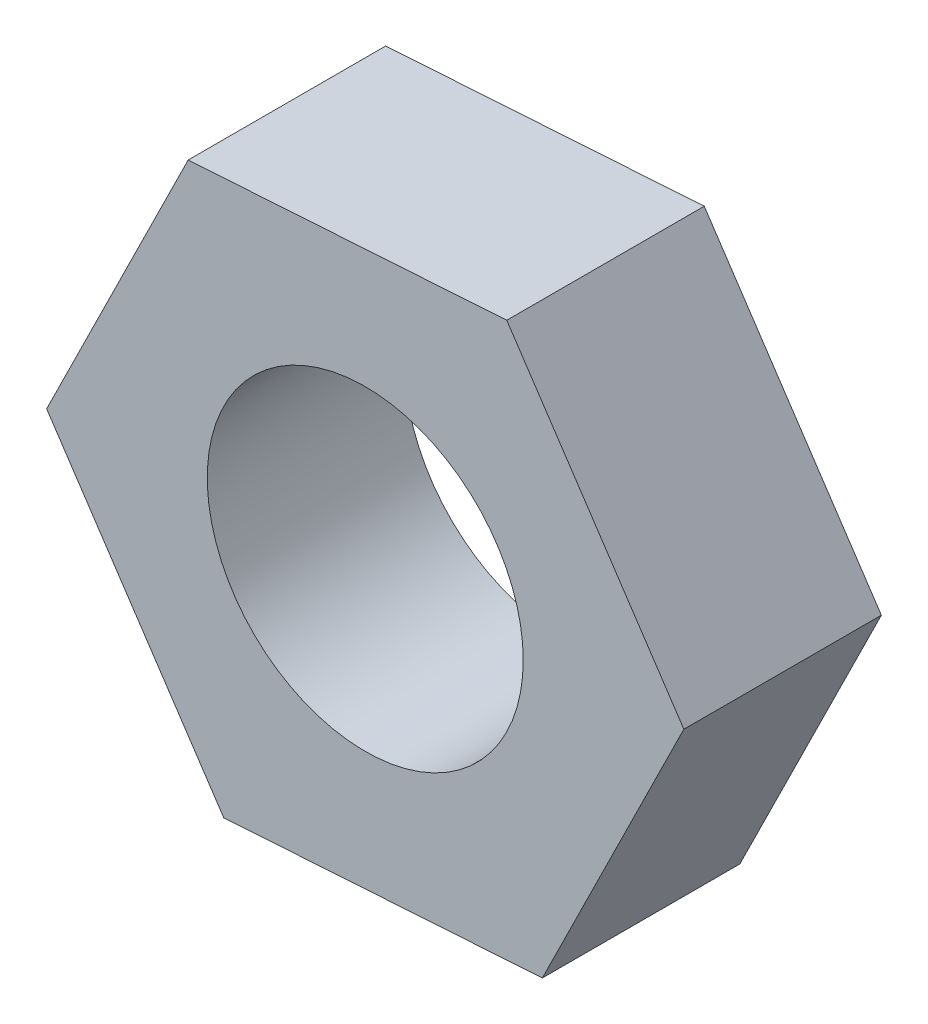
ISO-10303-21;
HEADER;
FILE_DESCRIPTION(('STEP AP214'),'2;1');
FILE_NAME('part.step','',(''),(''),'','','');
FILE_SCHEMA(('AUTOMOTIVE_DESIGN { 1 0 10303 214 1 1 1 1 }'));
ENDSEC;
DATA;
#1=APPLICATION_CONTEXT('core data for automotive mechanical design processes');
#2=APPLICATION_PROTOCOL_DEFINITION('international standard','automotive_design',2000,#1);
#3=PRODUCT_CONTEXT('',#1,'mechanical');
#4=PRODUCT('Part','Part','',(#3));
#5=PRODUCT_RELATED_PRODUCT_CATEGORY('part','',(#4));
#6=PRODUCT_DEFINITION_FORMATION('','',#4);
#7=PRODUCT_DEFINITION_CONTEXT('part definition',#1,'design');
#8=PRODUCT_DEFINITION('design','',#6,#7);
#9=PRODUCT_DEFINITION_SHAPE('','',#8);
#10=(LENGTH_UNIT() NAMED_UNIT(*) SI_UNIT(.MILLI.,.METRE.));
#11=(NAMED_UNIT(*) PLANE_ANGLE_UNIT() SI_UNIT($,.RADIAN.));
#12=(NAMED_UNIT(*) SI_UNIT($,.STERADIAN.) SOLID_ANGLE_UNIT());
#13=UNCERTAINTY_MEASURE_WITH_UNIT(LENGTH_MEASURE(1.E-05),#10,'distance_accuracy_value','');
#14=(GEOMETRIC_REPRESENTATION_CONTEXT(3) GLOBAL_UNCERTAINTY_ASSIGNED_CONTEXT((#13)) GLOBAL_UNIT_ASSIGNED_CONTEXT((#10,
#11,#12)) REPRESENTATION_CONTEXT('',''));
#15=CARTESIAN_POINT('',(0.,0.,0.));
#16=DIRECTION('',(0.,0.,1.));
#17=DIRECTION('',(1.,0.,0.));
#18=AXIS2_PLACEMENT_3D('',#15,#16,#17);
#19=CARTESIAN_POINT('',(0.,0.,2.5));
#20=DIRECTION('',(0.,0.,1.));
#21=DIRECTION('',(1.,0.,0.));
#22=AXIS2_PLACEMENT_3D('',#19,#20,#21);
#23=PLANE('',#22);
#24=DIRECTION('',(0.997926790235506,0.0643593142463478,0.));
#25=VECTOR('',#24,1.);
#26=CARTESIAN_POINT('',(-3.58255790709363,-7.24559260348346,2.5));
#27=LINE('',#26,#25);
#28=CARTESIAN_POINT('',(-3.58255790709363,-7.24559260348346,2.5));
#29=VERTEX_POINT('',#28);
#30=CARTESIAN_POINT('',(4.48358830654249,-6.72538245981362,2.5));
#31=VERTEX_POINT('',#30);
#32=EDGE_CURVE('E146',#29,#31,#27,.T.);
#33=ORIENTED_EDGE('',*,*,#32,.T.);
#34=DIRECTION('',(0.44322659401027,0.896409608584187,0.));
#35=VECTOR('',#34,1.);
#36=CARTESIAN_POINT('',(4.48358830654249,-6.72538245981362,2.5));
#37=LINE('',#36,#35);
#38=CARTESIAN_POINT('',(8.06614621363612,0.520210143669841,2.5));
#39=VERTEX_POINT('',#38);
#40=EDGE_CURVE('E94',#31,#39,#37,.T.);
#41=ORIENTED_EDGE('',*,*,#40,.T.);
#42=DIRECTION('',(-0.554700196225236,0.832050294337839,0.));
#43=VECTOR('',#42,1.);
#44=CARTESIAN_POINT('',(8.06614621363612,0.520210143669841,2.5));
#45=LINE('',#44,#43);
#46=CARTESIAN_POINT('',(3.58255790709363,7.24559260348346,2.5));
#47=VERTEX_POINT('',#46);
#48=EDGE_CURVE('E107',#39,#47,#45,.T.);
#49=ORIENTED_EDGE('',*,*,#48,.T.);
#50=DIRECTION('',(-0.997926790235506,-0.0643593142463477,0.));
#51=VECTOR('',#50,1.);
#52=CARTESIAN_POINT('',(3.58255790709363,7.24559260348346,2.5));
#53=LINE('',#52,#51);
#54=CARTESIAN_POINT('',(-4.4835883065425,6.72538245981362,2.5));
#55=VERTEX_POINT('',#54);
#56=EDGE_CURVE('E101',#47,#55,#53,.T.);
#57=ORIENTED_EDGE('',*,*,#56,.T.);
#58=DIRECTION('',(-0.44322659401027,-0.896409608584187,0.));
#59=VECTOR('',#58,1.);
#60=CARTESIAN_POINT('',(-4.4835883065425,6.72538245981362,2.5));
#61=LINE('',#60,#59);
#62=CARTESIAN_POINT('',(-8.06614621363612,-0.52021014366984,2.5));
#63=VERTEX_POINT('',#62);
#64=EDGE_CURVE('E105',#55,#63,#61,.T.);
#65=ORIENTED_EDGE('',*,*,#64,.T.);
#66=DIRECTION('',(0.554700196225236,-0.832050294337839,0.));
#67=VECTOR('',#66,1.);
#68=CARTESIAN_POINT('',(-8.06614621363612,-0.52021014366984,2.5));
#69=LINE('',#68,#67);
#70=EDGE_CURVE('E57',#63,#29,#69,.T.);
#71=ORIENTED_EDGE('',*,*,#70,.T.);
#72=EDGE_LOOP('',(#33,#41,#49,#57,#65,#71));
#73=FACE_BOUND('',#72,.T.);
#74=CARTESIAN_POINT('',(0.,0.,2.5));
#75=DIRECTION('',(0.,0.,1.));
#76=DIRECTION('',(1.,0.,0.));
#77=AXIS2_PLACEMENT_3D('',#74,#75,#76);
#78=CIRCLE('',#77,4.);
#79=CARTESIAN_POINT('',(4.,0.,2.5));
#80=VERTEX_POINT('',#79);
#81=EDGE_CURVE('E134',#80,#80,#78,.T.);
#82=ORIENTED_EDGE('',*,*,#81,.F.);
#83=EDGE_LOOP('',(#82));
#84=FACE_BOUND('',#83,.T.);
#85=ADVANCED_FACE('F39',(#73,#84),#23,.T.);
#86=CARTESIAN_POINT('',(0.,0.,-2.5));
#87=DIRECTION('',(0.,0.,1.));
#88=DIRECTION('',(1.,0.,0.));
#89=AXIS2_PLACEMENT_3D('',#86,#87,#88);
#90=PLANE('',#89);
#91=DIRECTION('',(0.997926790235506,0.0643593142463478,0.));
#92=VECTOR('',#91,1.);
#93=CARTESIAN_POINT('',(-3.58255790709363,-7.24559260348346,-2.5));
#94=LINE('',#93,#92);
#95=CARTESIAN_POINT('',(-3.58255790709363,-7.24559260348346,-2.5));
#96=VERTEX_POINT('',#95);
#97=CARTESIAN_POINT('',(4.48358830654249,-6.72538245981362,-2.5));
#98=VERTEX_POINT('',#97);
#99=EDGE_CURVE('E129',#96,#98,#94,.T.);
#100=ORIENTED_EDGE('',*,*,#99,.F.);
#101=DIRECTION('',(0.554700196225236,-0.832050294337839,0.));
#102=VECTOR('',#101,1.);
#103=CARTESIAN_POINT('',(-8.06614621363612,-0.52021014366984,-2.5));
#104=LINE('',#103,#102);
#105=CARTESIAN_POINT('',(-8.06614621363612,-0.52021014366984,-2.5));
#106=VERTEX_POINT('',#105);
#107=EDGE_CURVE('E86',#106,#96,#104,.T.);
#108=ORIENTED_EDGE('',*,*,#107,.F.);
#109=DIRECTION('',(-0.44322659401027,-0.896409608584187,0.));
#110=VECTOR('',#109,1.);
#111=CARTESIAN_POINT('',(-4.4835883065425,6.72538245981362,-2.5));
#112=LINE('',#111,#110);
#113=CARTESIAN_POINT('',(-4.4835883065425,6.72538245981362,-2.5));
#114=VERTEX_POINT('',#113);
#115=EDGE_CURVE('E80',#114,#106,#112,.T.);
#116=ORIENTED_EDGE('',*,*,#115,.F.);
#117=DIRECTION('',(-0.997926790235506,-0.0643593142463477,0.));
#118=VECTOR('',#117,1.);
#119=CARTESIAN_POINT('',(3.58255790709363,7.24559260348346,-2.5));
#120=LINE('',#119,#118);
#121=CARTESIAN_POINT('',(3.58255790709363,7.24559260348346,-2.5));
#122=VERTEX_POINT('',#121);
#123=EDGE_CURVE('E116',#122,#114,#120,.T.);
#124=ORIENTED_EDGE('',*,*,#123,.F.);
#125=DIRECTION('',(-0.554700196225236,0.832050294337839,0.));
#126=VECTOR('',#125,1.);
#127=CARTESIAN_POINT('',(8.06614621363612,0.520210143669841,-2.5));
#128=LINE('',#127,#126);
#129=CARTESIAN_POINT('',(8.06614621363612,0.520210143669841,-2.5));
#130=VERTEX_POINT('',#129);
#131=EDGE_CURVE('E137',#130,#122,#128,.T.);
#132=ORIENTED_EDGE('',*,*,#131,.F.);
#133=DIRECTION('',(0.44322659401027,0.896409608584187,0.));
#134=VECTOR('',#133,1.);
#135=CARTESIAN_POINT('',(4.48358830654249,-6.72538245981362,-2.5));
#136=LINE('',#135,#134);
#137=EDGE_CURVE('E133',#98,#130,#136,.T.);
#138=ORIENTED_EDGE('',*,*,#137,.F.);
#139=EDGE_LOOP('',(#100,#108,#116,#124,#132,#138));
#140=FACE_BOUND('',#139,.T.);
#141=CARTESIAN_POINT('',(0.,0.,-2.5));
#142=DIRECTION('',(0.,0.,1.));
#143=DIRECTION('',(1.,0.,0.));
#144=AXIS2_PLACEMENT_3D('',#141,#142,#143);
#145=CIRCLE('',#144,4.);
#146=CARTESIAN_POINT('',(4.,0.,-2.5));
#147=VERTEX_POINT('',#146);
#148=EDGE_CURVE('E243',#147,#147,#145,.T.);
#149=ORIENTED_EDGE('',*,*,#148,.T.);
#150=EDGE_LOOP('',(#149));
#151=FACE_BOUND('',#150,.T.);
#152=ADVANCED_FACE('F159',(#140,#151),#90,.F.);
#153=CARTESIAN_POINT('',(-3.58255790709363,-7.24559260348346,2.5));
#154=DIRECTION('',(-0.0643593142463478,0.997926790235506,0.));
#155=DIRECTION('',(-0.997926790235506,-0.0643593142463478,0.));
#156=AXIS2_PLACEMENT_3D('',#153,#154,#155);
#157=PLANE('',#156);
#158=ORIENTED_EDGE('',*,*,#99,.T.);
#159=DIRECTION('',(0.,0.,-1.));
#160=VECTOR('',#159,1.);
#161=CARTESIAN_POINT('',(4.48358830654249,-6.72538245981362,2.5));
#162=LINE('',#161,#160);
#163=EDGE_CURVE('E11',#31,#98,#162,.T.);
#164=ORIENTED_EDGE('',*,*,#163,.F.);
#165=ORIENTED_EDGE('',*,*,#32,.F.);
#166=DIRECTION('',(0.,0.,-1.));
#167=VECTOR('',#166,1.);
#168=CARTESIAN_POINT('',(-3.58255790709363,-7.24559260348346,2.5));
#169=LINE('',#168,#167);
#170=EDGE_CURVE('E125',#29,#96,#169,.T.);
#171=ORIENTED_EDGE('',*,*,#170,.T.);
#172=EDGE_LOOP('',(#158,#164,#165,#171));
#173=FACE_BOUND('',#172,.T.);
#174=ADVANCED_FACE('F41',(#173),#157,.F.);
#175=CARTESIAN_POINT('',(4.48358830654249,-6.72538245981362,2.5));
#176=DIRECTION('',(-0.896409608584187,0.44322659401027,0.));
#177=DIRECTION('',(-0.44322659401027,-0.896409608584187,0.));
#178=AXIS2_PLACEMENT_3D('',#175,#176,#177);
#179=PLANE('',#178);
#180=ORIENTED_EDGE('',*,*,#137,.T.);
#181=DIRECTION('',(0.,0.,-1.));
#182=VECTOR('',#181,1.);
#183=CARTESIAN_POINT('',(8.06614621363612,0.520210143669841,2.5));
#184=LINE('',#183,#182);
#185=EDGE_CURVE('E49',#39,#130,#184,.T.);
#186=ORIENTED_EDGE('',*,*,#185,.F.);
#187=ORIENTED_EDGE('',*,*,#40,.F.);
#188=ORIENTED_EDGE('',*,*,#163,.T.);
#189=EDGE_LOOP('',(#180,#186,#187,#188));
#190=FACE_BOUND('',#189,.T.);
#191=ADVANCED_FACE('F184',(#190),#179,.F.);
#192=CARTESIAN_POINT('',(8.06614621363612,0.520210143669841,2.5));
#193=DIRECTION('',(-0.832050294337839,-0.554700196225236,0.));
#194=DIRECTION('',(0.554700196225236,-0.832050294337839,0.));
#195=AXIS2_PLACEMENT_3D('',#192,#193,#194);
#196=PLANE('',#195);
#197=ORIENTED_EDGE('',*,*,#131,.T.);
#198=DIRECTION('',(0.,0.,-1.));
#199=VECTOR('',#198,1.);
#200=CARTESIAN_POINT('',(3.58255790709363,7.24559260348346,2.5));
#201=LINE('',#200,#199);
#202=EDGE_CURVE('E118',#47,#122,#201,.T.);
#203=ORIENTED_EDGE('',*,*,#202,.F.);
#204=ORIENTED_EDGE('',*,*,#48,.F.);
#205=ORIENTED_EDGE('',*,*,#185,.T.);
#206=EDGE_LOOP('',(#197,#203,#204,#205));
#207=FACE_BOUND('',#206,.T.);
#208=ADVANCED_FACE('F156',(#207),#196,.F.);
#209=CARTESIAN_POINT('',(3.58255790709363,7.24559260348346,2.5));
#210=DIRECTION('',(0.0643593142463477,-0.997926790235506,0.));
#211=DIRECTION('',(0.997926790235506,0.0643593142463477,0.));
#212=AXIS2_PLACEMENT_3D('',#209,#210,#211);
#213=PLANE('',#212);
#214=ORIENTED_EDGE('',*,*,#123,.T.);
#215=DIRECTION('',(0.,0.,-1.));
#216=VECTOR('',#215,1.);
#217=CARTESIAN_POINT('',(-4.4835883065425,6.72538245981362,2.5));
#218=LINE('',#217,#216);
#219=EDGE_CURVE('E113',#55,#114,#218,.T.);
#220=ORIENTED_EDGE('',*,*,#219,.F.);
#221=ORIENTED_EDGE('',*,*,#56,.F.);
#222=ORIENTED_EDGE('',*,*,#202,.T.);
#223=EDGE_LOOP('',(#214,#220,#221,#222));
#224=FACE_BOUND('',#223,.T.);
#225=ADVANCED_FACE('F114',(#224),#213,.F.);
#226=CARTESIAN_POINT('',(-4.4835883065425,6.72538245981362,2.5));
#227=DIRECTION('',(0.896409608584187,-0.44322659401027,0.));
#228=DIRECTION('',(0.44322659401027,0.896409608584187,0.));
#229=AXIS2_PLACEMENT_3D('',#226,#227,#228);
#230=PLANE('',#229);
#231=ORIENTED_EDGE('',*,*,#115,.T.);
#232=DIRECTION('',(0.,0.,-1.));
#233=VECTOR('',#232,1.);
#234=CARTESIAN_POINT('',(-8.06614621363612,-0.52021014366984,2.5));
#235=LINE('',#234,#233);
#236=EDGE_CURVE('E119',#63,#106,#235,.T.);
#237=ORIENTED_EDGE('',*,*,#236,.F.);
#238=ORIENTED_EDGE('',*,*,#64,.F.);
#239=ORIENTED_EDGE('',*,*,#219,.T.);
#240=EDGE_LOOP('',(#231,#237,#238,#239));
#241=FACE_BOUND('',#240,.T.);
#242=ADVANCED_FACE('F121',(#241),#230,.F.);
#243=CARTESIAN_POINT('',(-8.06614621363612,-0.52021014366984,2.5));
#244=DIRECTION('',(0.832050294337839,0.554700196225236,0.));
#245=DIRECTION('',(-0.554700196225236,0.832050294337839,0.));
#246=AXIS2_PLACEMENT_3D('',#243,#244,#245);
#247=PLANE('',#246);
#248=ORIENTED_EDGE('',*,*,#107,.T.);
#249=ORIENTED_EDGE('',*,*,#170,.F.);
#250=ORIENTED_EDGE('',*,*,#70,.F.);
#251=ORIENTED_EDGE('',*,*,#236,.T.);
#252=EDGE_LOOP('',(#248,#249,#250,#251));
#253=FACE_BOUND('',#252,.T.);
#254=ADVANCED_FACE('F164',(#253),#247,.F.);
#255=CARTESIAN_POINT('',(0.,0.,2.5));
#256=DIRECTION('',(0.,0.,-1.));
#257=DIRECTION('',(-1.,0.,0.));
#258=AXIS2_PLACEMENT_3D('',#255,#256,#257);
#259=CYLINDRICAL_SURFACE('',#258,4.);
#260=ORIENTED_EDGE('',*,*,#81,.T.);
#261=EDGE_LOOP('',(#260));
#262=FACE_BOUND('',#261,.T.);
#263=ORIENTED_EDGE('',*,*,#148,.F.);
#264=EDGE_LOOP('',(#263));
#265=FACE_BOUND('',#264,.T.);
#266=ADVANCED_FACE('F166',(#262,#265),#259,.F.);
#267=CLOSED_SHELL('',(#85,#152,#174,#191,#208,#225,#242,#254,#266));
#268=MANIFOLD_SOLID_BREP('B2',#267);
#269=ADVANCED_BREP_SHAPE_REPRESENTATION('',(#18,#268),#14);
#270=SHAPE_DEFINITION_REPRESENTATION(#9,#269);
ENDSEC;
END-ISO-10303-21;
